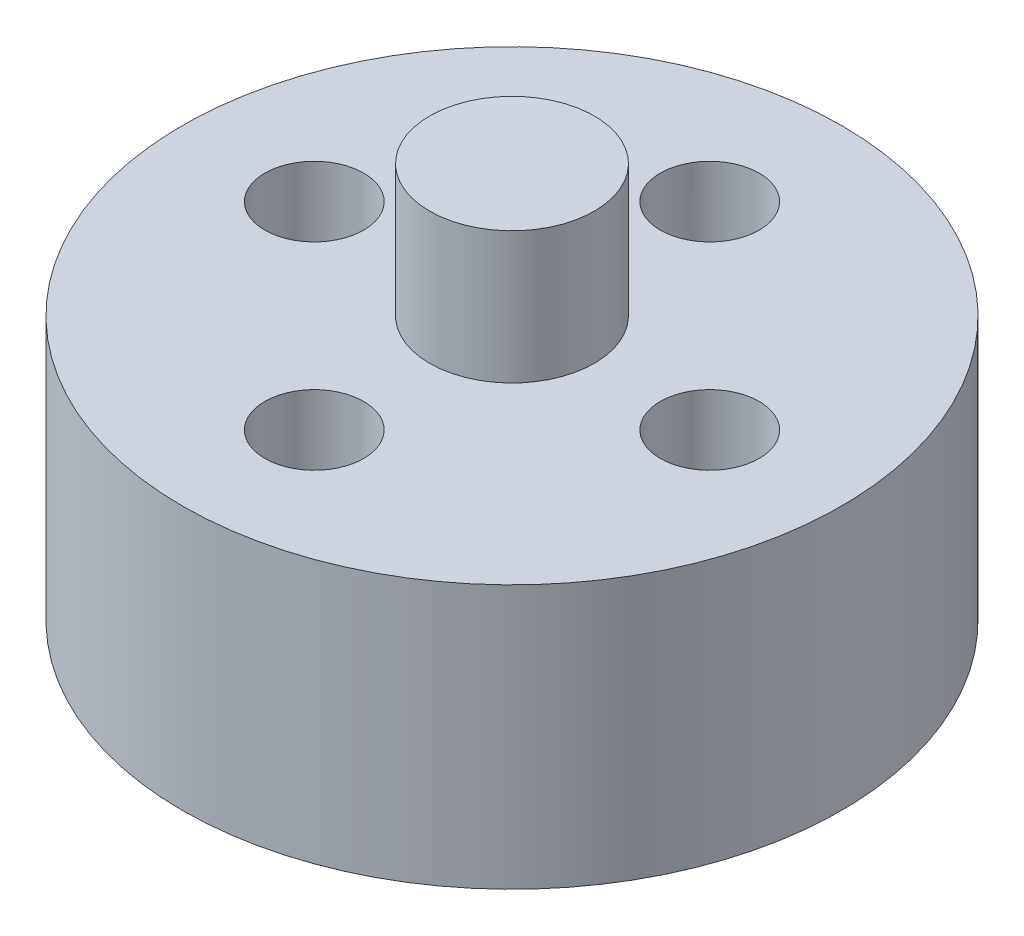
ISO-10303-21;
HEADER;
FILE_DESCRIPTION(('STEP AP214'),'2;1');
FILE_NAME('part.step','',(''),(''),'','','');
FILE_SCHEMA(('AUTOMOTIVE_DESIGN { 1 0 10303 214 1 1 1 1 }'));
ENDSEC;
DATA;
#1=APPLICATION_CONTEXT('core data for automotive mechanical design processes');
#2=APPLICATION_PROTOCOL_DEFINITION('international standard','automotive_design',2000,#1);
#3=PRODUCT_CONTEXT('',#1,'mechanical');
#4=PRODUCT('Part','Part','',(#3));
#5=PRODUCT_RELATED_PRODUCT_CATEGORY('part','',(#4));
#6=PRODUCT_DEFINITION_FORMATION('','',#4);
#7=PRODUCT_DEFINITION_CONTEXT('part definition',#1,'design');
#8=PRODUCT_DEFINITION('design','',#6,#7);
#9=PRODUCT_DEFINITION_SHAPE('','',#8);
#10=(LENGTH_UNIT() NAMED_UNIT(*) SI_UNIT(.MILLI.,.METRE.));
#11=(NAMED_UNIT(*) PLANE_ANGLE_UNIT() SI_UNIT($,.RADIAN.));
#12=(NAMED_UNIT(*) SI_UNIT($,.STERADIAN.) SOLID_ANGLE_UNIT());
#13=UNCERTAINTY_MEASURE_WITH_UNIT(LENGTH_MEASURE(1.E-05),#10,'distance_accuracy_value','');
#14=(GEOMETRIC_REPRESENTATION_CONTEXT(3) GLOBAL_UNCERTAINTY_ASSIGNED_CONTEXT((#13)) GLOBAL_UNIT_ASSIGNED_CONTEXT((#10,
#11,#12)) REPRESENTATION_CONTEXT('',''));
#15=CARTESIAN_POINT('',(0.,0.,0.));
#16=DIRECTION('',(0.,0.,1.));
#17=DIRECTION('',(1.,0.,0.));
#18=AXIS2_PLACEMENT_3D('',#15,#16,#17);
#19=CARTESIAN_POINT('',(0.,7.,0.));
#20=DIRECTION('',(0.,-1.,0.));
#21=DIRECTION('',(0.,0.,-1.));
#22=AXIS2_PLACEMENT_3D('',#19,#20,#21);
#23=CYLINDRICAL_SURFACE('',#22,10.);
#24=CARTESIAN_POINT('',(0.,0.,0.));
#25=DIRECTION('',(0.,1.,0.));
#26=DIRECTION('',(0.,0.,1.));
#27=AXIS2_PLACEMENT_3D('',#24,#25,#26);
#28=CIRCLE('',#27,10.);
#29=CARTESIAN_POINT('',(0.,0.,10.));
#30=VERTEX_POINT('',#29);
#31=EDGE_CURVE('E126',#30,#30,#28,.T.);
#32=ORIENTED_EDGE('',*,*,#31,.T.);
#33=EDGE_LOOP('',(#32));
#34=FACE_BOUND('',#33,.T.);
#35=CARTESIAN_POINT('',(0.,8.,0.));
#36=DIRECTION('',(0.,1.,0.));
#37=DIRECTION('',(0.,0.,1.));
#38=AXIS2_PLACEMENT_3D('',#35,#36,#37);
#39=CIRCLE('',#38,10.);
#40=CARTESIAN_POINT('',(0.,8.,10.));
#41=VERTEX_POINT('',#40);
#42=EDGE_CURVE('E122',#41,#41,#39,.T.);
#43=ORIENTED_EDGE('',*,*,#42,.F.);
#44=EDGE_LOOP('',(#43));
#45=FACE_BOUND('',#44,.T.);
#46=CARTESIAN_POINT('',(0.,4.4,-10.));
#47=CARTESIAN_POINT('',(0.0782282971881735,4.39999673029268,-9.99999880704253));
#48=CARTESIAN_POINT('',(0.156503461724666,4.39342108994606,-9.99907239830974));
#49=CARTESIAN_POINT('',(0.310870001631006,4.36729658198318,-9.9954659078926));
#50=CARTESIAN_POINT('',(0.386959105753097,4.3477346968671,-9.99278406658853));
#51=CARTESIAN_POINT('',(0.534696857228106,4.29623018412248,-9.98596840414154));
#52=CARTESIAN_POINT('',(0.606348663725388,4.26429648495289,-9.98183563030519));
#53=CARTESIAN_POINT('',(0.743264435399571,4.1889757140463,-9.97257602428289));
#54=CARTESIAN_POINT('',(0.808529373042032,4.14559038966625,-9.96744934378478));
#55=CARTESIAN_POINT('',(0.931277418149651,4.04828120014413,-9.95673376484668));
#56=CARTESIAN_POINT('',(0.988710498897954,3.99429451372395,-9.95114223163037));
#57=CARTESIAN_POINT('',(1.09373320547752,3.8774501852534,-9.94014802878934));
#58=CARTESIAN_POINT('',(1.1413222933247,3.81459205868558,-9.93474536950016));
#59=CARTESIAN_POINT('',(1.22549749849271,3.68145746599968,-9.92471494953013));
#60=CARTESIAN_POINT('',(1.26203583392651,3.61115051096699,-9.92009059124433));
#61=CARTESIAN_POINT('',(1.32276708626735,3.46532237017278,-9.91217589223061));
#62=CARTESIAN_POINT('',(1.34696058897522,3.38980143202415,-9.90888548820393));
#63=CARTESIAN_POINT('',(1.38216138600053,3.23621255610498,-9.90403689130405));
#64=CARTESIAN_POINT('',(1.39325387196612,3.15816450274326,-9.90246751199675));
#65=CARTESIAN_POINT('',(1.40220155009302,3.00130017466003,-9.90120459692899));
#66=CARTESIAN_POINT('',(1.40005740590941,2.92248393865131,-9.90151096712263));
#67=CARTESIAN_POINT('',(1.38266243777218,2.7669189229665,-9.90395470049609));
#68=CARTESIAN_POINT('',(1.36750605461999,2.69015934616801,-9.90607887001526));
#69=CARTESIAN_POINT('',(1.32466447511777,2.54028374311314,-9.9118982681395));
#70=CARTESIAN_POINT('',(1.29697896640555,2.46716780774643,-9.91559353591331));
#71=CARTESIAN_POINT('',(1.22976542329452,2.32636509242907,-9.92415350790331));
#72=CARTESIAN_POINT('',(1.19019695060767,2.25869786805941,-9.92902219396419));
#73=CARTESIAN_POINT('',(1.10036953501586,2.13092789747748,-9.93937746928839));
#74=CARTESIAN_POINT('',(1.05010997981794,2.07082558483201,-9.94486409393343));
#75=CARTESIAN_POINT('',(0.939806577010352,1.95934382592274,-9.95589549462252));
#76=CARTESIAN_POINT('',(0.87968144399792,1.9080447806889,-9.96144036144259));
#77=CARTESIAN_POINT('',(0.751631847221716,1.81625380087083,-9.97191903802371));
#78=CARTESIAN_POINT('',(0.683707356784825,1.77576190324768,-9.97685284569487));
#79=CARTESIAN_POINT('',(0.541920722447897,1.70673222539118,-9.98555772534513));
#80=CARTESIAN_POINT('',(0.468055762281817,1.67820015538247,-9.98932824168404));
#81=CARTESIAN_POINT('',(0.316518429788042,1.63396738383472,-9.99527691675257));
#82=CARTESIAN_POINT('',(0.238846281695039,1.61826592756202,-9.99745516914294));
#83=CARTESIAN_POINT('',(0.0825938477894391,1.60024586041428,-9.9999615811838));
#84=CARTESIAN_POINT('',(0.0040265562431382,1.59781662239642,-10.0003050337974));
#85=CARTESIAN_POINT('',(-0.152394144717357,1.60611702311462,-9.99914463509872));
#86=CARTESIAN_POINT('',(-0.23024757325217,1.61684630835998,-9.99764083341115));
#87=CARTESIAN_POINT('',(-0.382699132210732,1.6510672292578,-9.99296437014804));
#88=CARTESIAN_POINT('',(-0.457309485151302,1.67450545090937,-9.9897986949705));
#89=CARTESIAN_POINT('',(-0.60154116976591,1.73342292765794,-9.98215251897454));
#90=CARTESIAN_POINT('',(-0.67116229365304,1.76890268389735,-9.97767196343473));
#91=CARTESIAN_POINT('',(-0.803928908116773,1.8511590407096,-9.96785651297204));
#92=CARTESIAN_POINT('',(-0.867030161469618,1.8980064017085,-9.96251634013149));
#93=CARTESIAN_POINT('',(-0.984514153494661,2.00156896270423,-9.95159382460353));
#94=CARTESIAN_POINT('',(-1.0388964535897,2.05828465879491,-9.9460114697519));
#95=CARTESIAN_POINT('',(-1.13779715487911,2.18046429585883,-9.93518580711721));
#96=CARTESIAN_POINT('',(-1.18224173853561,2.24598826787819,-9.92994522900698));
#97=CARTESIAN_POINT('',(-1.25949361855925,2.38363643829299,-9.92044339319114));
#98=CARTESIAN_POINT('',(-1.29230119646798,2.45576047695566,-9.91618211179366));
#99=CARTESIAN_POINT('',(-1.345231206824,2.6043337369715,-9.90914065473312));
#100=CARTESIAN_POINT('',(-1.36539364982936,2.68076847353202,-9.90635581183086));
#101=CARTESIAN_POINT('',(-1.39258907049338,2.83598074840612,-9.90256973520278));
#102=CARTESIAN_POINT('',(-1.3996228287002,2.91475814715696,-9.90156839544136));
#103=CARTESIAN_POINT('',(-1.40034443203664,3.07168441470692,-9.90146630506884));
#104=CARTESIAN_POINT('',(-1.3941482942421,3.14983276427078,-9.90234903246055));
#105=CARTESIAN_POINT('',(-1.3688333716359,3.30396489330755,-9.90587987183737));
#106=CARTESIAN_POINT('',(-1.34971459743688,3.37994867455804,-9.90852798237267));
#107=CARTESIAN_POINT('',(-1.29913617920526,3.5275696803371,-9.91528571653348));
#108=CARTESIAN_POINT('',(-1.26768359307711,3.59920936371037,-9.91939450417525));
#109=CARTESIAN_POINT('',(-1.19334180710318,3.73621340818566,-9.92861179338548));
#110=CARTESIAN_POINT('',(-1.15045232161689,3.80157761249994,-9.93372031992192));
#111=CARTESIAN_POINT('',(-1.05402880045864,3.92476633056217,-9.94441498086101));
#112=CARTESIAN_POINT('',(-1.00040857472563,3.98252307100271,-9.95000475889879));
#113=CARTESIAN_POINT('',(-0.88422735121956,4.08826118300655,-9.96100092698614));
#114=CARTESIAN_POINT('',(-0.821664267052117,4.13624026706072,-9.96640727387546));
#115=CARTESIAN_POINT('',(-0.68902522551936,4.22126210095552,-9.9764565456144));
#116=CARTESIAN_POINT('',(-0.618914862292062,4.25825160443586,-9.98109570676177));
#117=CARTESIAN_POINT('',(-0.473447613388805,4.31987644563263,-9.98905061891876));
#118=CARTESIAN_POINT('',(-0.39809637122268,4.34452484498498,-9.99236776836323));
#119=CARTESIAN_POINT('',(-0.268653720963261,4.37504522263121,-9.99652970400107));
#120=CARTESIAN_POINT('',(-0.215369033513962,4.38438932668763,-9.99782452761314));
#121=CARTESIAN_POINT('',(-0.108063681641057,4.39686781330664,-9.99956008335212));
#122=CARTESIAN_POINT('',(-0.0540430246858417,4.40000225883574,-10.0000008241395));
#123=CARTESIAN_POINT('',(0.,4.4,-10.));
#124=B_SPLINE_CURVE_WITH_KNOTS('',3,(#46,#47,#48,#49,#50,#51,#52,#53,#54,#55,#56,#57,#58,#59,
#60,#61,#62,#63,#64,#65,#66,#67,#68,#69,#70,#71,#72,#73,#74,#75,#76,#77,#78,#79,#80,#81,#82,#83,
#84,#85,#86,#87,#88,#89,#90,#91,#92,#93,#94,#95,#96,#97,#98,#99,#100,#101,#102,#103,#104,#105,
#106,#107,#108,#109,#110,#111,#112,#113,#114,#115,#116,#117,#118,#119,#120,#121,#122,#123),
.UNSPECIFIED.,.T.,.F.,(4,2,2,2,2,2,2,2,2,2,2,2,2,2,2,2,2,2,2,2,2,2,2,2,2,2,2,2,2,2,2,2,2,2,2,2,
2,2,4),(0.,0.234487445699966,0.469210298847026,0.703764072406697,0.938282077027582,
1.17423416905446,1.41019915269479,1.64717029041254,1.88413018206406,2.11954056518414,
2.35493914544916,2.58864354479997,2.82235377092959,3.05686851420482,3.29139669207855,
3.52796437553467,3.76453286805565,4.00121418200078,4.23788157266709,4.47257323924711,
4.70725860120586,4.94096517128054,5.1746814689058,5.40989169440529,5.64511374764217,
5.88202891996441,6.11893836005413,6.35509436054734,6.59123632025849,6.82531598707863,
7.05939546166267,7.29334118154645,7.52729274485311,7.76320483684767,7.99917205791182,
8.23626460203056,8.47310567775886,8.63509999149646,8.79709266258835),.UNSPECIFIED.);
#125=CARTESIAN_POINT('',(0.,4.4,-10.));
#126=VERTEX_POINT('',#125);
#127=EDGE_CURVE('E110',#126,#126,#124,.T.);
#128=ORIENTED_EDGE('',*,*,#127,.F.);
#129=EDGE_LOOP('',(#128));
#130=FACE_BOUND('',#129,.T.);
#131=ADVANCED_FACE('F44',(#34,#45,#130),#23,.T.);
#132=CARTESIAN_POINT('',(0.,7.,0.));
#133=DIRECTION('',(0.,-1.,0.));
#134=DIRECTION('',(0.,0.,-1.));
#135=AXIS2_PLACEMENT_3D('',#132,#133,#134);
#136=CYLINDRICAL_SURFACE('',#135,2.);
#137=DIRECTION('',(0.,-1.,0.));
#138=VECTOR('',#137,1.);
#139=CARTESIAN_POINT('',(-1.32287565553229,7.,-1.5));
#140=LINE('',#139,#138);
#141=CARTESIAN_POINT('',(-1.32287565553229,2.54174243050441,-1.5));
#142=VERTEX_POINT('',#141);
#143=CARTESIAN_POINT('',(-1.32287565553229,0.,-1.5));
#144=VERTEX_POINT('',#143);
#145=EDGE_CURVE('E137',#142,#144,#140,.T.);
#146=ORIENTED_EDGE('',*,*,#145,.F.);
#147=CARTESIAN_POINT('',(-1.32287565553229,2.54174243050441,-1.5));
#148=CARTESIAN_POINT('',(-1.33236372231704,2.56913697323399,-1.4916320246662));
#149=CARTESIAN_POINT('',(-1.34105311749732,2.59697067610244,-1.48380927239847));
#150=CARTESIAN_POINT('',(-1.35675265789455,2.65346678142647,-1.46946755297769));
#151=CARTESIAN_POINT('',(-1.36376105816754,2.68213001068497,-1.46294994176492));
#152=CARTESIAN_POINT('',(-1.38207321611407,2.76900682505484,-1.4457389546025));
#153=CARTESIAN_POINT('',(-1.39072927961803,2.82829385685095,-1.43732787675608));
#154=CARTESIAN_POINT('',(-1.40035705460434,2.94846364315376,-1.42795346144735));
#155=CARTESIAN_POINT('',(-1.40127931356085,3.00935417309218,-1.42703805468009));
#156=CARTESIAN_POINT('',(-1.39523381635767,3.13033947655891,-1.43294696571483));
#157=CARTESIAN_POINT('',(-1.38826913140062,3.19043455062415,-1.43976827081667));
#158=CARTESIAN_POINT('',(-1.37113288160096,3.2851999067176,-1.45604591339335));
#159=CARTESIAN_POINT('',(-1.36325535660078,3.32068490447257,-1.46345177427917));
#160=CARTESIAN_POINT('',(-1.34494051168325,3.39042349106625,-1.48030010788648));
#161=CARTESIAN_POINT('',(-1.33450790312792,3.42467921478427,-1.48973882836334));
#162=CARTESIAN_POINT('',(-1.32287565553229,3.45825756949559,-1.5));
#163=B_SPLINE_CURVE_WITH_KNOTS('',3,(#147,#148,#149,#150,#151,#152,#153,#154,#155,#156,#157,
#158,#159,#160,#161,#162),.UNSPECIFIED.,.F.,.F.,(4,2,2,2,2,2,2,4),(0.,0.0904911767502334,
0.181075884544439,0.361633399040197,0.543344585049004,0.724985036431793,0.836122019978367,
0.947055598962521),.UNSPECIFIED.);
#164=CARTESIAN_POINT('',(-1.32287565553229,3.45825756949559,-1.5));
#165=VERTEX_POINT('',#164);
#166=EDGE_CURVE('E168',#142,#165,#163,.T.);
#167=ORIENTED_EDGE('',*,*,#166,.T.);
#168=CARTESIAN_POINT('',(-1.32287565553229,7.,-1.5));
#169=VERTEX_POINT('',#168);
#170=EDGE_CURVE('E142',#169,#165,#140,.T.);
#171=ORIENTED_EDGE('',*,*,#170,.F.);
#172=CARTESIAN_POINT('',(0.,7.,0.));
#173=DIRECTION('',(0.,1.,0.));
#174=DIRECTION('',(0.,0.,1.));
#175=AXIS2_PLACEMENT_3D('',#172,#173,#174);
#176=CIRCLE('',#175,2.);
#177=CARTESIAN_POINT('',(1.32287565553229,7.,-1.5));
#178=VERTEX_POINT('',#177);
#179=EDGE_CURVE('E130',#169,#178,#176,.T.);
#180=ORIENTED_EDGE('',*,*,#179,.T.);
#181=DIRECTION('',(0.,-1.,0.));
#182=VECTOR('',#181,1.);
#183=CARTESIAN_POINT('',(1.32287565553229,7.,-1.5));
#184=LINE('',#183,#182);
#185=CARTESIAN_POINT('',(1.32287565553229,3.45825756949559,-1.5));
#186=VERTEX_POINT('',#185);
#187=EDGE_CURVE('E146',#178,#186,#184,.T.);
#188=ORIENTED_EDGE('',*,*,#187,.T.);
#189=CARTESIAN_POINT('',(1.32287565553229,3.45825756949559,-1.5));
#190=CARTESIAN_POINT('',(1.33236372231704,3.43086302676601,-1.4916320246662));
#191=CARTESIAN_POINT('',(1.34105311749732,3.40302932389756,-1.48380927239847));
#192=CARTESIAN_POINT('',(1.35675265789455,3.34653321857353,-1.46946755297769));
#193=CARTESIAN_POINT('',(1.36376105816754,3.31786998931503,-1.46294994176492));
#194=CARTESIAN_POINT('',(1.38207321611407,3.23099317494516,-1.4457389546025));
#195=CARTESIAN_POINT('',(1.39072927961803,3.17170614314905,-1.43732787675608));
#196=CARTESIAN_POINT('',(1.40035705460434,3.05153635684624,-1.42795346144735));
#197=CARTESIAN_POINT('',(1.40127931356085,2.99064582690782,-1.42703805468009));
#198=CARTESIAN_POINT('',(1.39523381635767,2.86966052344109,-1.43294696571483));
#199=CARTESIAN_POINT('',(1.38826913140062,2.80956544937585,-1.43976827081667));
#200=CARTESIAN_POINT('',(1.37113288160096,2.7148000932824,-1.45604591339335));
#201=CARTESIAN_POINT('',(1.36325535660078,2.67931509552743,-1.46345177427917));
#202=CARTESIAN_POINT('',(1.34494051168325,2.60957650893375,-1.48030010788648));
#203=CARTESIAN_POINT('',(1.33450790312792,2.57532078521573,-1.48973882836334));
#204=CARTESIAN_POINT('',(1.32287565553229,2.54174243050441,-1.5));
#205=B_SPLINE_CURVE_WITH_KNOTS('',3,(#189,#190,#191,#192,#193,#194,#195,#196,#197,#198,#199,
#200,#201,#202,#203,#204),.UNSPECIFIED.,.F.,.F.,(4,2,2,2,2,2,2,4),(0.,0.0904911767502334,
0.18107588454444,0.361633399040197,0.543344585049004,0.724985036431792,0.836122019978366,
0.94705559896252),.UNSPECIFIED.);
#206=CARTESIAN_POINT('',(1.32287565553229,2.54174243050441,-1.5));
#207=VERTEX_POINT('',#206);
#208=EDGE_CURVE('E59',#186,#207,#205,.T.);
#209=ORIENTED_EDGE('',*,*,#208,.T.);
#210=CARTESIAN_POINT('',(1.32287565553229,0.,-1.5));
#211=VERTEX_POINT('',#210);
#212=EDGE_CURVE('E145',#207,#211,#184,.T.);
#213=ORIENTED_EDGE('',*,*,#212,.T.);
#214=CARTESIAN_POINT('',(0.,0.,0.));
#215=DIRECTION('',(0.,1.,0.));
#216=DIRECTION('',(0.,0.,1.));
#217=AXIS2_PLACEMENT_3D('',#214,#215,#216);
#218=CIRCLE('',#217,2.);
#219=EDGE_CURVE('E129',#144,#211,#218,.T.);
#220=ORIENTED_EDGE('',*,*,#219,.F.);
#221=EDGE_LOOP('',(#146,#167,#171,#180,#188,#209,#213,#220));
#222=FACE_BOUND('',#221,.T.);
#223=ADVANCED_FACE('F162',(#222),#136,.F.);
#224=CARTESIAN_POINT('',(-1.32287565553229,7.,-1.5));
#225=DIRECTION('',(0.,0.,1.));
#226=DIRECTION('',(1.,0.,0.));
#227=AXIS2_PLACEMENT_3D('',#224,#225,#226);
#228=PLANE('',#227);
#229=ORIENTED_EDGE('',*,*,#212,.F.);
#230=CARTESIAN_POINT('',(0.,3.,-1.5));
#231=DIRECTION('',(0.,0.,1.));
#232=DIRECTION('',(1.,0.,0.));
#233=AXIS2_PLACEMENT_3D('',#230,#231,#232);
#234=CIRCLE('',#233,1.4);
#235=EDGE_CURVE('E114',#207,#142,#234,.F.);
#236=ORIENTED_EDGE('',*,*,#235,.T.);
#237=ORIENTED_EDGE('',*,*,#145,.T.);
#238=DIRECTION('',(-1.,0.,0.));
#239=VECTOR('',#238,1.);
#240=CARTESIAN_POINT('',(-1.32287565553229,0.,-1.5));
#241=LINE('',#240,#239);
#242=EDGE_CURVE('E134',#211,#144,#241,.T.);
#243=ORIENTED_EDGE('',*,*,#242,.F.);
#244=EDGE_LOOP('',(#229,#236,#237,#243));
#245=FACE_BOUND('',#244,.T.);
#246=ADVANCED_FACE('F167',(#245),#228,.T.);
#247=CARTESIAN_POINT('',(0.,4.,-6.));
#248=DIRECTION('',(0.,1.,0.));
#249=DIRECTION('',(0.,0.,1.));
#250=AXIS2_PLACEMENT_3D('',#247,#248,#249);
#251=CYLINDRICAL_SURFACE('',#250,1.5);
#252=CARTESIAN_POINT('',(0.,8.,-6.));
#253=DIRECTION('',(0.,1.,0.));
#254=DIRECTION('',(0.,0.,1.));
#255=AXIS2_PLACEMENT_3D('',#252,#253,#254);
#256=CIRCLE('',#255,1.5);
#257=CARTESIAN_POINT('',(0.,8.,-4.5));
#258=VERTEX_POINT('',#257);
#259=EDGE_CURVE('E112',#258,#258,#256,.T.);
#260=ORIENTED_EDGE('',*,*,#259,.T.);
#261=EDGE_LOOP('',(#260));
#262=FACE_BOUND('',#261,.T.);
#263=CARTESIAN_POINT('',(0.979795897113271,4.,-7.13578166916011));
#264=CARTESIAN_POINT('',(0.931503442268452,4.04732070511619,-7.17748199010839));
#265=CARTESIAN_POINT('',(0.878772751356522,4.09211285466792,-7.21754619856575));
#266=CARTESIAN_POINT('',(0.764279614143455,4.17512762235204,-7.29250936983083));
#267=CARTESIAN_POINT('',(0.70244407068385,4.21329103972637,-7.32736143491472));
#268=CARTESIAN_POINT('',(0.582594173197967,4.27445238789968,-7.38351630740796));
#269=CARTESIAN_POINT('',(0.525978452016534,4.29894918695603,-7.40613253417618));
#270=CARTESIAN_POINT('',(0.408151661775285,4.34063430308395,-7.44472716289571));
#271=CARTESIAN_POINT('',(0.346956099397508,4.3578460762298,-7.46072686462527));
#272=CARTESIAN_POINT('',(0.220780412986538,4.38399188639217,-7.48506257405334));
#273=CARTESIAN_POINT('',(0.155774327950218,4.39285981225115,-7.49333737072189));
#274=CARTESIAN_POINT('',(0.0245975524627516,4.40132450217311,-7.50123538393503));
#275=CARTESIAN_POINT('',(-0.0415734115166217,4.4009190589163,-7.50085654067263));
#276=CARTESIAN_POINT('',(-0.165100149795554,4.39145256556599,-7.49202486580214));
#277=CARTESIAN_POINT('',(-0.222603947442113,4.38337924822359,-7.48449340397134));
#278=CARTESIAN_POINT('',(-0.335031904187578,4.36053078254278,-7.46322474011105));
#279=CARTESIAN_POINT('',(-0.389956704355349,4.34575730951794,-7.4494890893866));
#280=CARTESIAN_POINT('',(-0.498280187310663,4.30962224695652,-7.41600223026491));
#281=CARTESIAN_POINT('',(-0.551529034973259,4.2880199401519,-7.3960316216157));
#282=CARTESIAN_POINT('',(-0.653442199080783,4.2394381385133,-7.35133881948209));
#283=CARTESIAN_POINT('',(-0.702099191193001,4.21245025991997,-7.32660921980821));
#284=CARTESIAN_POINT('',(-0.791257158327065,4.15607254651544,-7.27529391951853));
#285=CARTESIAN_POINT('',(-0.83208898488192,4.1269758480086,-7.24895309185784));
#286=CARTESIAN_POINT('',(-0.909245020378941,4.06568372833704,-7.19394599296261));
#287=CARTESIAN_POINT('',(-0.945590237248621,4.03350410798,-7.16529168658763));
#288=CARTESIAN_POINT('',(-0.979795897113271,4.,-7.13578166916));
#289=B_SPLINE_CURVE_WITH_KNOTS('',3,(#263,#264,#265,#266,#267,#268,#269,#270,#271,#272,#273,
#274,#275,#276,#277,#278,#279,#280,#281,#282,#283,#284,#285,#286,#287,#288),.UNSPECIFIED.,.F.,
.F.,(4,2,2,2,2,2,2,2,2,2,2,2,4),(0.,0.238666382159527,0.479365449059479,0.675671444384814,
0.871340481610678,1.06854712988841,1.26580071932246,1.44066380854484,1.61548319891185,
1.79732222086377,1.97944655272981,2.14903667444005,2.31779989221203),.UNSPECIFIED.);
#290=CARTESIAN_POINT('',(0.979795897113271,4.,-7.13578166916011));
#291=VERTEX_POINT('',#290);
#292=CARTESIAN_POINT('',(-0.979795897113271,4.,-7.13578166916));
#293=VERTEX_POINT('',#292);
#294=EDGE_CURVE('E67',#291,#293,#289,.T.);
#295=ORIENTED_EDGE('',*,*,#294,.F.);
#296=CARTESIAN_POINT('',(0.,4.,-6.));
#297=DIRECTION('',(0.,1.,0.));
#298=DIRECTION('',(0.,0.,1.));
#299=AXIS2_PLACEMENT_3D('',#296,#297,#298);
#300=CIRCLE('',#299,1.5);
#301=CARTESIAN_POINT('',(0.979795897113271,4.,-4.86421833083989));
#302=VERTEX_POINT('',#301);
#303=EDGE_CURVE('E107',#302,#291,#300,.T.);
#304=ORIENTED_EDGE('',*,*,#303,.F.);
#305=CARTESIAN_POINT('',(-0.979795897113271,4.,-4.86421833084));
#306=CARTESIAN_POINT('',(-0.931503442268451,4.04732070511619,-4.82251800989171));
#307=CARTESIAN_POINT('',(-0.878772751356521,4.09211285466792,-4.78245380143434));
#308=CARTESIAN_POINT('',(-0.764279614143452,4.17512762235205,-4.70749063016924));
#309=CARTESIAN_POINT('',(-0.702444070683844,4.21329103972638,-4.67263856508535));
#310=CARTESIAN_POINT('',(-0.58259417319796,4.27445238789968,-4.61648369259209));
#311=CARTESIAN_POINT('',(-0.525978452016527,4.29894918695604,-4.59386746582386));
#312=CARTESIAN_POINT('',(-0.408151661775278,4.34063430308395,-4.55527283710432));
#313=CARTESIAN_POINT('',(-0.3469560993975,4.3578460762298,-4.53927313537476));
#314=CARTESIAN_POINT('',(-0.220780412986529,4.38399188639217,-4.51493742594668));
#315=CARTESIAN_POINT('',(-0.155774327950208,4.39285981225115,-4.50666262927812));
#316=CARTESIAN_POINT('',(-0.0245975524627386,4.40132450217311,-4.49876461606497));
#317=CARTESIAN_POINT('',(0.0415734115166365,4.4009190589163,-4.49914345932736));
#318=CARTESIAN_POINT('',(0.165100149795571,4.39145256556599,-4.50797513419785));
#319=CARTESIAN_POINT('',(0.222603947442131,4.38337924822359,-4.51550659602865));
#320=CARTESIAN_POINT('',(0.335031904187598,4.36053078254277,-4.53677525988893));
#321=CARTESIAN_POINT('',(0.38995670435537,4.34575730951793,-4.55051091061337));
#322=CARTESIAN_POINT('',(0.498280187310686,4.30962224695651,-4.58399776973505));
#323=CARTESIAN_POINT('',(0.551529034973281,4.28801994015189,-4.60396837838426));
#324=CARTESIAN_POINT('',(0.653442199080806,4.23943813851329,-4.64866118051785));
#325=CARTESIAN_POINT('',(0.702099191193024,4.21245025991995,-4.67339078019173));
#326=CARTESIAN_POINT('',(0.791257158327083,4.15607254651543,-4.7247060804814));
#327=CARTESIAN_POINT('',(0.832088984881934,4.12697584800859,-4.75104690814209));
#328=CARTESIAN_POINT('',(0.909245020378947,4.06568372833703,-4.8060540070373));
#329=CARTESIAN_POINT('',(0.945590237248624,4.03350410797999,-4.83470831341227));
#330=CARTESIAN_POINT('',(0.979795897113271,4.,-4.86421833083989));
#331=B_SPLINE_CURVE_WITH_KNOTS('',3,(#305,#306,#307,#308,#309,#310,#311,#312,#313,#314,#315,
#316,#317,#318,#319,#320,#321,#322,#323,#324,#325,#326,#327,#328,#329,#330),.UNSPECIFIED.,.F.,
.F.,(4,2,2,2,2,2,2,2,2,2,2,2,4),(0.,0.238666382159544,0.479365449059511,0.67567144438485,
0.87134048161072,1.06854712988846,1.26580071932252,1.44066380854489,1.6154831989119,
1.79732222086382,1.97944655272986,2.14903667444008,2.31779989221203),.UNSPECIFIED.);
#332=CARTESIAN_POINT('',(-0.979795897113271,4.,-4.86421833084));
#333=VERTEX_POINT('',#332);
#334=EDGE_CURVE('E97',#333,#302,#331,.T.);
#335=ORIENTED_EDGE('',*,*,#334,.F.);
#336=EDGE_CURVE('E105',#293,#333,#300,.T.);
#337=ORIENTED_EDGE('',*,*,#336,.F.);
#338=EDGE_LOOP('',(#295,#304,#335,#337));
#339=FACE_BOUND('',#338,.T.);
#340=ADVANCED_FACE('F104',(#262,#339),#251,.F.);
#341=CARTESIAN_POINT('',(0.,4.,-6.));
#342=DIRECTION('',(0.,1.,0.));
#343=DIRECTION('',(0.,0.,1.));
#344=AXIS2_PLACEMENT_3D('',#341,#342,#343);
#345=PLANE('',#344);
#346=ORIENTED_EDGE('',*,*,#303,.T.);
#347=DIRECTION('',(0.,0.,-1.));
#348=VECTOR('',#347,1.);
#349=CARTESIAN_POINT('',(0.979795897113271,4.,0.5));
#350=LINE('',#349,#348);
#351=EDGE_CURVE('E11',#291,#302,#350,.F.);
#352=ORIENTED_EDGE('',*,*,#351,.T.);
#353=EDGE_LOOP('',(#346,#352));
#354=FACE_BOUND('',#353,.T.);
#355=ADVANCED_FACE('F233',(#354),#345,.T.);
#356=ORIENTED_EDGE('',*,*,#336,.T.);
#357=DIRECTION('',(0.,0.,-1.));
#358=VECTOR('',#357,1.);
#359=CARTESIAN_POINT('',(-0.979795897113271,4.,0.5));
#360=LINE('',#359,#358);
#361=EDGE_CURVE('E52',#333,#293,#360,.T.);
#362=ORIENTED_EDGE('',*,*,#361,.T.);
#363=EDGE_LOOP('',(#356,#362));
#364=FACE_BOUND('',#363,.T.);
#365=ADVANCED_FACE('F109',(#364),#345,.T.);
#366=CARTESIAN_POINT('',(0.,0.,0.));
#367=DIRECTION('',(0.,1.,0.));
#368=DIRECTION('',(0.,0.,1.));
#369=AXIS2_PLACEMENT_3D('',#366,#367,#368);
#370=PLANE('',#369);
#371=ORIENTED_EDGE('',*,*,#31,.F.);
#372=EDGE_LOOP('',(#371));
#373=FACE_BOUND('',#372,.T.);
#374=ORIENTED_EDGE('',*,*,#219,.T.);
#375=ORIENTED_EDGE('',*,*,#242,.T.);
#376=EDGE_LOOP('',(#374,#375));
#377=FACE_BOUND('',#376,.T.);
#378=ADVANCED_FACE('F154',(#373,#377),#370,.F.);
#379=ORIENTED_EDGE('',*,*,#170,.T.);
#380=EDGE_CURVE('E170',#165,#186,#234,.F.);
#381=ORIENTED_EDGE('',*,*,#380,.T.);
#382=ORIENTED_EDGE('',*,*,#187,.F.);
#383=DIRECTION('',(-1.,0.,0.));
#384=VECTOR('',#383,1.);
#385=CARTESIAN_POINT('',(-1.32287565553229,7.,-1.5));
#386=LINE('',#385,#384);
#387=EDGE_CURVE('E133',#178,#169,#386,.T.);
#388=ORIENTED_EDGE('',*,*,#387,.T.);
#389=EDGE_LOOP('',(#379,#381,#382,#388));
#390=FACE_BOUND('',#389,.T.);
#391=ADVANCED_FACE('F157',(#390),#228,.T.);
#392=CARTESIAN_POINT('',(0.,7.,0.));
#393=DIRECTION('',(0.,1.,0.));
#394=DIRECTION('',(0.,0.,1.));
#395=AXIS2_PLACEMENT_3D('',#392,#393,#394);
#396=PLANE('',#395);
#397=ORIENTED_EDGE('',*,*,#387,.F.);
#398=ORIENTED_EDGE('',*,*,#179,.F.);
#399=EDGE_LOOP('',(#397,#398));
#400=FACE_BOUND('',#399,.T.);
#401=ADVANCED_FACE('F217',(#400),#396,.F.);
#402=CARTESIAN_POINT('',(0.,8.,0.));
#403=DIRECTION('',(0.,1.,0.));
#404=DIRECTION('',(0.,0.,1.));
#405=AXIS2_PLACEMENT_3D('',#402,#403,#404);
#406=PLANE('',#405);
#407=CARTESIAN_POINT('',(6.,8.,0.));
#408=DIRECTION('',(0.,1.,0.));
#409=DIRECTION('',(0.,0.,1.));
#410=AXIS2_PLACEMENT_3D('',#407,#408,#409);
#411=CIRCLE('',#410,1.5);
#412=CARTESIAN_POINT('',(6.,8.,1.5));
#413=VERTEX_POINT('',#412);
#414=EDGE_CURVE('E393',#413,#413,#411,.T.);
#415=ORIENTED_EDGE('',*,*,#414,.F.);
#416=EDGE_LOOP('',(#415));
#417=FACE_BOUND('',#416,.T.);
#418=CARTESIAN_POINT('',(0.,8.,6.));
#419=DIRECTION('',(0.,1.,0.));
#420=DIRECTION('',(0.,0.,1.));
#421=AXIS2_PLACEMENT_3D('',#418,#419,#420);
#422=CIRCLE('',#421,1.5);
#423=CARTESIAN_POINT('',(0.,8.,7.5));
#424=VERTEX_POINT('',#423);
#425=EDGE_CURVE('E388',#424,#424,#422,.T.);
#426=ORIENTED_EDGE('',*,*,#425,.F.);
#427=EDGE_LOOP('',(#426));
#428=FACE_BOUND('',#427,.T.);
#429=CARTESIAN_POINT('',(-6.,8.,0.));
#430=DIRECTION('',(0.,1.,0.));
#431=DIRECTION('',(0.,0.,1.));
#432=AXIS2_PLACEMENT_3D('',#429,#430,#431);
#433=CIRCLE('',#432,1.5);
#434=CARTESIAN_POINT('',(-6.,8.,1.49999999999996));
#435=VERTEX_POINT('',#434);
#436=EDGE_CURVE('E383',#435,#435,#433,.T.);
#437=ORIENTED_EDGE('',*,*,#436,.F.);
#438=EDGE_LOOP('',(#437));
#439=FACE_BOUND('',#438,.T.);
#440=ORIENTED_EDGE('',*,*,#259,.F.);
#441=EDGE_LOOP('',(#440));
#442=FACE_BOUND('',#441,.T.);
#443=CARTESIAN_POINT('',(0.,8.,0.));
#444=DIRECTION('',(0.,1.,0.));
#445=DIRECTION('',(0.,0.,1.));
#446=AXIS2_PLACEMENT_3D('',#443,#444,#445);
#447=CIRCLE('',#446,2.5);
#448=CARTESIAN_POINT('',(0.,8.,2.5));
#449=VERTEX_POINT('',#448);
#450=EDGE_CURVE('E101',#449,#449,#447,.T.);
#451=ORIENTED_EDGE('',*,*,#450,.F.);
#452=EDGE_LOOP('',(#451));
#453=FACE_BOUND('',#452,.T.);
#454=ORIENTED_EDGE('',*,*,#42,.T.);
#455=EDGE_LOOP('',(#454));
#456=FACE_BOUND('',#455,.T.);
#457=ADVANCED_FACE('F220',(#417,#428,#439,#442,#453,#456),#406,.T.);
#458=CARTESIAN_POINT('',(0.,12.,0.));
#459=DIRECTION('',(0.,-1.,0.));
#460=DIRECTION('',(0.,0.,-1.));
#461=AXIS2_PLACEMENT_3D('',#458,#459,#460);
#462=CYLINDRICAL_SURFACE('',#461,2.5);
#463=CARTESIAN_POINT('',(0.,12.,0.));
#464=DIRECTION('',(0.,1.,0.));
#465=DIRECTION('',(0.,0.,1.));
#466=AXIS2_PLACEMENT_3D('',#463,#464,#465);
#467=CIRCLE('',#466,2.5);
#468=CARTESIAN_POINT('',(0.,12.,2.5));
#469=VERTEX_POINT('',#468);
#470=EDGE_CURVE('E119',#469,#469,#467,.T.);
#471=ORIENTED_EDGE('',*,*,#470,.F.);
#472=EDGE_LOOP('',(#471));
#473=FACE_BOUND('',#472,.T.);
#474=ORIENTED_EDGE('',*,*,#450,.T.);
#475=EDGE_LOOP('',(#474));
#476=FACE_BOUND('',#475,.T.);
#477=ADVANCED_FACE('F224',(#473,#476),#462,.T.);
#478=CARTESIAN_POINT('',(0.,12.,0.));
#479=DIRECTION('',(0.,1.,0.));
#480=DIRECTION('',(0.,0.,1.));
#481=AXIS2_PLACEMENT_3D('',#478,#479,#480);
#482=PLANE('',#481);
#483=ORIENTED_EDGE('',*,*,#470,.T.);
#484=EDGE_LOOP('',(#483));
#485=FACE_BOUND('',#484,.T.);
#486=ADVANCED_FACE('F228',(#485),#482,.T.);
#487=CARTESIAN_POINT('',(-6.,4.,0.));
#488=DIRECTION('',(0.,1.,0.));
#489=DIRECTION('',(0.,0.,1.));
#490=AXIS2_PLACEMENT_3D('',#487,#488,#489);
#491=CYLINDRICAL_SURFACE('',#490,1.5);
#492=CARTESIAN_POINT('',(-6.,4.,0.));
#493=DIRECTION('',(0.,1.,0.));
#494=DIRECTION('',(0.,0.,1.));
#495=AXIS2_PLACEMENT_3D('',#492,#493,#494);
#496=CIRCLE('',#495,1.5);
#497=CARTESIAN_POINT('',(-6.,4.,1.49999999999996));
#498=VERTEX_POINT('',#497);
#499=EDGE_CURVE('E380',#498,#498,#496,.T.);
#500=ORIENTED_EDGE('',*,*,#499,.F.);
#501=EDGE_LOOP('',(#500));
#502=FACE_BOUND('',#501,.T.);
#503=ORIENTED_EDGE('',*,*,#436,.T.);
#504=EDGE_LOOP('',(#503));
#505=FACE_BOUND('',#504,.T.);
#506=ADVANCED_FACE('F231',(#502,#505),#491,.F.);
#507=CARTESIAN_POINT('',(-6.,4.,0.));
#508=DIRECTION('',(0.,1.,0.));
#509=DIRECTION('',(0.,0.,1.));
#510=AXIS2_PLACEMENT_3D('',#507,#508,#509);
#511=PLANE('',#510);
#512=ORIENTED_EDGE('',*,*,#499,.T.);
#513=EDGE_LOOP('',(#512));
#514=FACE_BOUND('',#513,.T.);
#515=ADVANCED_FACE('F309',(#514),#511,.T.);
#516=CARTESIAN_POINT('',(0.,4.,6.));
#517=DIRECTION('',(0.,1.,0.));
#518=DIRECTION('',(0.,0.,1.));
#519=AXIS2_PLACEMENT_3D('',#516,#517,#518);
#520=CYLINDRICAL_SURFACE('',#519,1.5);
#521=CARTESIAN_POINT('',(0.,4.,6.));
#522=DIRECTION('',(0.,1.,0.));
#523=DIRECTION('',(0.,0.,1.));
#524=AXIS2_PLACEMENT_3D('',#521,#522,#523);
#525=CIRCLE('',#524,1.5);
#526=CARTESIAN_POINT('',(0.,4.,7.5));
#527=VERTEX_POINT('',#526);
#528=EDGE_CURVE('E385',#527,#527,#525,.T.);
#529=ORIENTED_EDGE('',*,*,#528,.F.);
#530=EDGE_LOOP('',(#529));
#531=FACE_BOUND('',#530,.T.);
#532=ORIENTED_EDGE('',*,*,#425,.T.);
#533=EDGE_LOOP('',(#532));
#534=FACE_BOUND('',#533,.T.);
#535=ADVANCED_FACE('F299',(#531,#534),#520,.F.);
#536=CARTESIAN_POINT('',(0.,4.,6.));
#537=DIRECTION('',(0.,1.,0.));
#538=DIRECTION('',(0.,0.,1.));
#539=AXIS2_PLACEMENT_3D('',#536,#537,#538);
#540=PLANE('',#539);
#541=ORIENTED_EDGE('',*,*,#528,.T.);
#542=EDGE_LOOP('',(#541));
#543=FACE_BOUND('',#542,.T.);
#544=ADVANCED_FACE('F290',(#543),#540,.T.);
#545=CARTESIAN_POINT('',(6.,4.,0.));
#546=DIRECTION('',(0.,1.,0.));
#547=DIRECTION('',(0.,0.,1.));
#548=AXIS2_PLACEMENT_3D('',#545,#546,#547);
#549=CYLINDRICAL_SURFACE('',#548,1.5);
#550=CARTESIAN_POINT('',(6.,4.,0.));
#551=DIRECTION('',(0.,1.,0.));
#552=DIRECTION('',(0.,0.,1.));
#553=AXIS2_PLACEMENT_3D('',#550,#551,#552);
#554=CIRCLE('',#553,1.5);
#555=CARTESIAN_POINT('',(6.,4.,1.5));
#556=VERTEX_POINT('',#555);
#557=EDGE_CURVE('E123',#556,#556,#554,.T.);
#558=ORIENTED_EDGE('',*,*,#557,.F.);
#559=EDGE_LOOP('',(#558));
#560=FACE_BOUND('',#559,.T.);
#561=ORIENTED_EDGE('',*,*,#414,.T.);
#562=EDGE_LOOP('',(#561));
#563=FACE_BOUND('',#562,.T.);
#564=ADVANCED_FACE('F283',(#560,#563),#549,.F.);
#565=CARTESIAN_POINT('',(6.,4.,0.));
#566=DIRECTION('',(0.,1.,0.));
#567=DIRECTION('',(0.,0.,1.));
#568=AXIS2_PLACEMENT_3D('',#565,#566,#567);
#569=PLANE('',#568);
#570=ORIENTED_EDGE('',*,*,#557,.T.);
#571=EDGE_LOOP('',(#570));
#572=FACE_BOUND('',#571,.T.);
#573=ADVANCED_FACE('F192',(#572),#569,.T.);
#574=CARTESIAN_POINT('',(0.,3.,0.5));
#575=DIRECTION('',(0.,0.,-1.));
#576=DIRECTION('',(-1.,0.,0.));
#577=AXIS2_PLACEMENT_3D('',#574,#575,#576);
#578=CYLINDRICAL_SURFACE('',#577,1.4);
#579=ORIENTED_EDGE('',*,*,#208,.F.);
#580=ORIENTED_EDGE('',*,*,#380,.F.);
#581=ORIENTED_EDGE('',*,*,#166,.F.);
#582=ORIENTED_EDGE('',*,*,#235,.F.);
#583=EDGE_LOOP('',(#579,#580,#581,#582));
#584=FACE_BOUND('',#583,.T.);
#585=ORIENTED_EDGE('',*,*,#294,.T.);
#586=ORIENTED_EDGE('',*,*,#361,.F.);
#587=ORIENTED_EDGE('',*,*,#334,.T.);
#588=ORIENTED_EDGE('',*,*,#351,.F.);
#589=EDGE_LOOP('',(#585,#586,#587,#588));
#590=FACE_BOUND('',#589,.T.);
#591=ORIENTED_EDGE('',*,*,#127,.T.);
#592=EDGE_LOOP('',(#591));
#593=FACE_BOUND('',#592,.T.);
#594=ADVANCED_FACE('F95',(#584,#590,#593),#578,.F.);
#595=CLOSED_SHELL('',(#131,#223,#246,#340,#355,#365,#378,#391,#401,#457,#477,#486,#506,#515,
#535,#544,#564,#573,#594));
#596=MANIFOLD_SOLID_BREP('B2',#595);
#597=ADVANCED_BREP_SHAPE_REPRESENTATION('',(#18,#596),#14);
#598=SHAPE_DEFINITION_REPRESENTATION(#9,#597);
ENDSEC;
END-ISO-10303-21;
